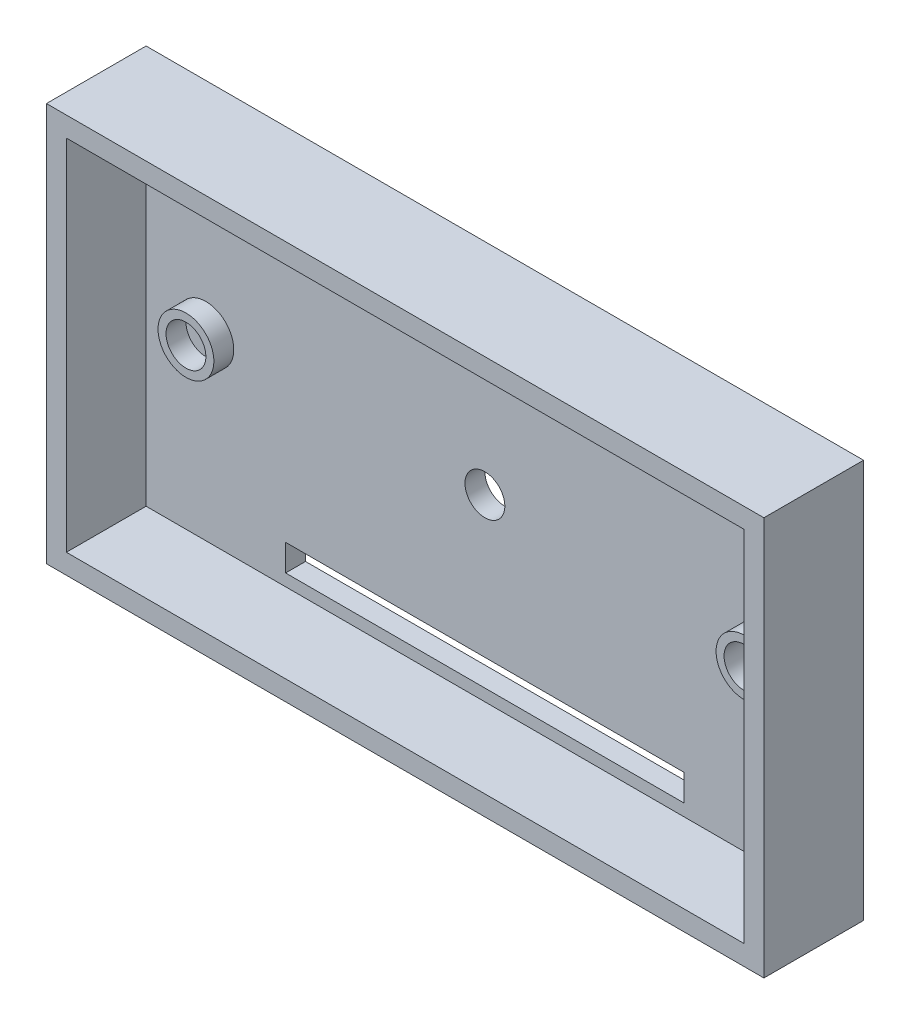
ISO-10303-21;
HEADER;
FILE_DESCRIPTION(('STEP AP214'),'2;1');
FILE_NAME('part.step','',(''),(''),'','','');
FILE_SCHEMA(('AUTOMOTIVE_DESIGN { 1 0 10303 214 1 1 1 1 }'));
ENDSEC;
DATA;
#1=APPLICATION_CONTEXT('core data for automotive mechanical design processes');
#2=APPLICATION_PROTOCOL_DEFINITION('international standard','automotive_design',2000,#1);
#3=PRODUCT_CONTEXT('',#1,'mechanical');
#4=PRODUCT('Part','Part','',(#3));
#5=PRODUCT_RELATED_PRODUCT_CATEGORY('part','',(#4));
#6=PRODUCT_DEFINITION_FORMATION('','',#4);
#7=PRODUCT_DEFINITION_CONTEXT('part definition',#1,'design');
#8=PRODUCT_DEFINITION('design','',#6,#7);
#9=PRODUCT_DEFINITION_SHAPE('','',#8);
#10=(LENGTH_UNIT() NAMED_UNIT(*) SI_UNIT(.MILLI.,.METRE.));
#11=(NAMED_UNIT(*) PLANE_ANGLE_UNIT() SI_UNIT($,.RADIAN.));
#12=(NAMED_UNIT(*) SI_UNIT($,.STERADIAN.) SOLID_ANGLE_UNIT());
#13=UNCERTAINTY_MEASURE_WITH_UNIT(LENGTH_MEASURE(1.E-05),#10,'distance_accuracy_value','');
#14=(GEOMETRIC_REPRESENTATION_CONTEXT(3) GLOBAL_UNCERTAINTY_ASSIGNED_CONTEXT((#13)) GLOBAL_UNIT_ASSIGNED_CONTEXT((#10,
#11,#12)) REPRESENTATION_CONTEXT('',''));
#15=CARTESIAN_POINT('',(0.,0.,0.));
#16=DIRECTION('',(0.,0.,1.));
#17=DIRECTION('',(1.,0.,0.));
#18=AXIS2_PLACEMENT_3D('',#15,#16,#17);
#19=CARTESIAN_POINT('',(57.15,-31.75,3.175));
#20=DIRECTION('',(-1.,0.,0.));
#21=DIRECTION('',(0.,0.,1.));
#22=AXIS2_PLACEMENT_3D('',#19,#20,#21);
#23=PLANE('',#22);
#24=DIRECTION('',(0.,1.,0.));
#25=VECTOR('',#24,1.);
#26=CARTESIAN_POINT('',(57.15,-31.75,0.));
#27=LINE('',#26,#25);
#28=CARTESIAN_POINT('',(57.15,-31.75,0.));
#29=VERTEX_POINT('',#28);
#30=CARTESIAN_POINT('',(57.15,31.75,0.));
#31=VERTEX_POINT('',#30);
#32=EDGE_CURVE('E267',#29,#31,#27,.T.);
#33=ORIENTED_EDGE('',*,*,#32,.T.);
#34=DIRECTION('',(0.,0.,-1.));
#35=VECTOR('',#34,1.);
#36=CARTESIAN_POINT('',(57.15,31.75,3.175));
#37=LINE('',#36,#35);
#38=CARTESIAN_POINT('',(57.15,31.75,15.875));
#39=VERTEX_POINT('',#38);
#40=EDGE_CURVE('E285',#39,#31,#37,.T.);
#41=ORIENTED_EDGE('',*,*,#40,.F.);
#42=DIRECTION('',(0.,1.,0.));
#43=VECTOR('',#42,1.);
#44=CARTESIAN_POINT('',(57.15,-31.75,15.875));
#45=LINE('',#44,#43);
#46=CARTESIAN_POINT('',(57.15,-31.75,15.875));
#47=VERTEX_POINT('',#46);
#48=EDGE_CURVE('E261',#47,#39,#45,.T.);
#49=ORIENTED_EDGE('',*,*,#48,.F.);
#50=DIRECTION('',(0.,0.,-1.));
#51=VECTOR('',#50,1.);
#52=CARTESIAN_POINT('',(57.15,-31.75,3.175));
#53=LINE('',#52,#51);
#54=EDGE_CURVE('E276',#47,#29,#53,.T.);
#55=ORIENTED_EDGE('',*,*,#54,.T.);
#56=EDGE_LOOP('',(#33,#41,#49,#55));
#57=FACE_BOUND('',#56,.T.);
#58=ADVANCED_FACE('F38',(#57),#23,.F.);
#59=CARTESIAN_POINT('',(-57.15,31.75,3.175));
#60=DIRECTION('',(0.,-1.,0.));
#61=DIRECTION('',(0.,0.,-1.));
#62=AXIS2_PLACEMENT_3D('',#59,#60,#61);
#63=PLANE('',#62);
#64=DIRECTION('',(-1.,0.,0.));
#65=VECTOR('',#64,1.);
#66=CARTESIAN_POINT('',(-57.15,31.75,0.));
#67=LINE('',#66,#65);
#68=CARTESIAN_POINT('',(-57.15,31.75,0.));
#69=VERTEX_POINT('',#68);
#70=EDGE_CURVE('E270',#31,#69,#67,.T.);
#71=ORIENTED_EDGE('',*,*,#70,.T.);
#72=DIRECTION('',(0.,0.,-1.));
#73=VECTOR('',#72,1.);
#74=CARTESIAN_POINT('',(-57.15,31.75,3.175));
#75=LINE('',#74,#73);
#76=CARTESIAN_POINT('',(-57.15,31.75,15.875));
#77=VERTEX_POINT('',#76);
#78=EDGE_CURVE('E282',#77,#69,#75,.T.);
#79=ORIENTED_EDGE('',*,*,#78,.F.);
#80=DIRECTION('',(-1.,0.,0.));
#81=VECTOR('',#80,1.);
#82=CARTESIAN_POINT('',(57.15,31.75,15.875));
#83=LINE('',#82,#81);
#84=EDGE_CURVE('E264',#39,#77,#83,.T.);
#85=ORIENTED_EDGE('',*,*,#84,.F.);
#86=ORIENTED_EDGE('',*,*,#40,.T.);
#87=EDGE_LOOP('',(#71,#79,#85,#86));
#88=FACE_BOUND('',#87,.T.);
#89=ADVANCED_FACE('F340',(#88),#63,.F.);
#90=CARTESIAN_POINT('',(-57.15,-31.75,3.175));
#91=DIRECTION('',(1.,0.,0.));
#92=DIRECTION('',(0.,0.,-1.));
#93=AXIS2_PLACEMENT_3D('',#90,#91,#92);
#94=PLANE('',#93);
#95=DIRECTION('',(0.,-1.,0.));
#96=VECTOR('',#95,1.);
#97=CARTESIAN_POINT('',(-57.15,-31.75,0.));
#98=LINE('',#97,#96);
#99=CARTESIAN_POINT('',(-57.15,-31.75,0.));
#100=VERTEX_POINT('',#99);
#101=EDGE_CURVE('E272',#69,#100,#98,.T.);
#102=ORIENTED_EDGE('',*,*,#101,.T.);
#103=DIRECTION('',(0.,0.,-1.));
#104=VECTOR('',#103,1.);
#105=CARTESIAN_POINT('',(-57.15,-31.75,3.175));
#106=LINE('',#105,#104);
#107=CARTESIAN_POINT('',(-57.15,-31.75,15.875));
#108=VERTEX_POINT('',#107);
#109=EDGE_CURVE('E279',#108,#100,#106,.T.);
#110=ORIENTED_EDGE('',*,*,#109,.F.);
#111=DIRECTION('',(0.,-1.,0.));
#112=VECTOR('',#111,1.);
#113=CARTESIAN_POINT('',(-57.15,31.75,15.875));
#114=LINE('',#113,#112);
#115=EDGE_CURVE('E255',#77,#108,#114,.T.);
#116=ORIENTED_EDGE('',*,*,#115,.F.);
#117=ORIENTED_EDGE('',*,*,#78,.T.);
#118=EDGE_LOOP('',(#102,#110,#116,#117));
#119=FACE_BOUND('',#118,.T.);
#120=ADVANCED_FACE('F338',(#119),#94,.F.);
#121=CARTESIAN_POINT('',(-57.15,-31.75,3.175));
#122=DIRECTION('',(0.,1.,0.));
#123=DIRECTION('',(0.,0.,1.));
#124=AXIS2_PLACEMENT_3D('',#121,#122,#123);
#125=PLANE('',#124);
#126=DIRECTION('',(1.,0.,0.));
#127=VECTOR('',#126,1.);
#128=CARTESIAN_POINT('',(-57.15,-31.75,0.));
#129=LINE('',#128,#127);
#130=EDGE_CURVE('E274',#100,#29,#129,.T.);
#131=ORIENTED_EDGE('',*,*,#130,.T.);
#132=ORIENTED_EDGE('',*,*,#54,.F.);
#133=DIRECTION('',(1.,0.,0.));
#134=VECTOR('',#133,1.);
#135=CARTESIAN_POINT('',(-57.15,-31.75,15.875));
#136=LINE('',#135,#134);
#137=EDGE_CURVE('E258',#108,#47,#136,.T.);
#138=ORIENTED_EDGE('',*,*,#137,.F.);
#139=ORIENTED_EDGE('',*,*,#109,.T.);
#140=EDGE_LOOP('',(#131,#132,#138,#139));
#141=FACE_BOUND('',#140,.T.);
#142=ADVANCED_FACE('F320',(#141),#125,.F.);
#143=CARTESIAN_POINT('',(0.,0.,0.));
#144=DIRECTION('',(0.,0.,-1.));
#145=DIRECTION('',(-1.,0.,0.));
#146=AXIS2_PLACEMENT_3D('',#143,#144,#145);
#147=PLANE('',#146);
#148=DIRECTION('',(0.,-1.,0.));
#149=VECTOR('',#148,1.);
#150=CARTESIAN_POINT('',(31.75,-26.67,0.));
#151=LINE('',#150,#149);
#152=CARTESIAN_POINT('',(31.75,-22.436666582,0.));
#153=VERTEX_POINT('',#152);
#154=CARTESIAN_POINT('',(31.75,-26.67,0.));
#155=VERTEX_POINT('',#154);
#156=EDGE_CURVE('E52',#153,#155,#151,.T.);
#157=ORIENTED_EDGE('',*,*,#156,.F.);
#158=DIRECTION('',(1.,0.,0.));
#159=VECTOR('',#158,1.);
#160=CARTESIAN_POINT('',(31.75,-22.436666582,0.));
#161=LINE('',#160,#159);
#162=CARTESIAN_POINT('',(-31.75,-22.436666582,0.));
#163=VERTEX_POINT('',#162);
#164=EDGE_CURVE('E206',#163,#153,#161,.T.);
#165=ORIENTED_EDGE('',*,*,#164,.F.);
#166=DIRECTION('',(0.,1.,0.));
#167=VECTOR('',#166,1.);
#168=CARTESIAN_POINT('',(-31.75,-26.67,0.));
#169=LINE('',#168,#167);
#170=CARTESIAN_POINT('',(-31.75,-26.67,0.));
#171=VERTEX_POINT('',#170);
#172=EDGE_CURVE('E203',#171,#163,#169,.T.);
#173=ORIENTED_EDGE('',*,*,#172,.F.);
#174=DIRECTION('',(-1.,0.,0.));
#175=VECTOR('',#174,1.);
#176=CARTESIAN_POINT('',(31.75,-26.67,0.));
#177=LINE('',#176,#175);
#178=EDGE_CURVE('E200',#155,#171,#177,.T.);
#179=ORIENTED_EDGE('',*,*,#178,.F.);
#180=EDGE_LOOP('',(#157,#165,#173,#179));
#181=FACE_BOUND('',#180,.T.);
#182=DIRECTION('',(0.,-1.,0.));
#183=VECTOR('',#182,1.);
#184=CARTESIAN_POINT('',(31.75,26.67,0.));
#185=LINE('',#184,#183);
#186=CARTESIAN_POINT('',(31.75,26.67,0.));
#187=VERTEX_POINT('',#186);
#188=CARTESIAN_POINT('',(31.75,22.436666582,0.));
#189=VERTEX_POINT('',#188);
#190=EDGE_CURVE('E60',#187,#189,#185,.T.);
#191=ORIENTED_EDGE('',*,*,#190,.F.);
#192=DIRECTION('',(1.,0.,0.));
#193=VECTOR('',#192,1.);
#194=CARTESIAN_POINT('',(31.75,26.67,0.));
#195=LINE('',#194,#193);
#196=CARTESIAN_POINT('',(-31.75,26.67,0.));
#197=VERTEX_POINT('',#196);
#198=EDGE_CURVE('E158',#197,#187,#195,.T.);
#199=ORIENTED_EDGE('',*,*,#198,.F.);
#200=DIRECTION('',(0.,1.,0.));
#201=VECTOR('',#200,1.);
#202=CARTESIAN_POINT('',(-31.75,26.67,0.));
#203=LINE('',#202,#201);
#204=CARTESIAN_POINT('',(-31.75,22.436666582,0.));
#205=VERTEX_POINT('',#204);
#206=EDGE_CURVE('E181',#205,#197,#203,.T.);
#207=ORIENTED_EDGE('',*,*,#206,.F.);
#208=DIRECTION('',(-1.,0.,0.));
#209=VECTOR('',#208,1.);
#210=CARTESIAN_POINT('',(31.75,22.436666582,0.));
#211=LINE('',#210,#209);
#212=EDGE_CURVE('E174',#189,#205,#211,.T.);
#213=ORIENTED_EDGE('',*,*,#212,.F.);
#214=EDGE_LOOP('',(#191,#199,#207,#213));
#215=FACE_BOUND('',#214,.T.);
#216=CARTESIAN_POINT('',(0.,0.,0.));
#217=DIRECTION('',(0.,0.,-1.));
#218=DIRECTION('',(-1.,0.,0.));
#219=AXIS2_PLACEMENT_3D('',#216,#217,#218);
#220=CIRCLE('',#219,3.175);
#221=CARTESIAN_POINT('',(-3.175,0.,0.));
#222=VERTEX_POINT('',#221);
#223=EDGE_CURVE('E166',#222,#222,#220,.T.);
#224=ORIENTED_EDGE('',*,*,#223,.F.);
#225=EDGE_LOOP('',(#224));
#226=FACE_BOUND('',#225,.T.);
#227=ORIENTED_EDGE('',*,*,#32,.F.);
#228=ORIENTED_EDGE('',*,*,#130,.F.);
#229=ORIENTED_EDGE('',*,*,#101,.F.);
#230=ORIENTED_EDGE('',*,*,#70,.F.);
#231=EDGE_LOOP('',(#227,#228,#229,#230));
#232=FACE_BOUND('',#231,.T.);
#233=ADVANCED_FACE('F316',(#181,#215,#226,#232),#147,.T.);
#234=CARTESIAN_POINT('',(0.,0.,15.875));
#235=DIRECTION('',(0.,0.,1.));
#236=DIRECTION('',(1.,0.,0.));
#237=AXIS2_PLACEMENT_3D('',#234,#235,#236);
#238=PLANE('',#237);
#239=ORIENTED_EDGE('',*,*,#115,.T.);
#240=ORIENTED_EDGE('',*,*,#137,.T.);
#241=ORIENTED_EDGE('',*,*,#48,.T.);
#242=ORIENTED_EDGE('',*,*,#84,.T.);
#243=EDGE_LOOP('',(#239,#240,#241,#242));
#244=FACE_BOUND('',#243,.T.);
#245=DIRECTION('',(0.,1.,0.));
#246=VECTOR('',#245,1.);
#247=CARTESIAN_POINT('',(53.975,-28.575,15.875));
#248=LINE('',#247,#246);
#249=CARTESIAN_POINT('',(53.975,-28.575,15.875));
#250=VERTEX_POINT('',#249);
#251=CARTESIAN_POINT('',(53.975,28.575,15.875));
#252=VERTEX_POINT('',#251);
#253=EDGE_CURVE('E228',#250,#252,#248,.T.);
#254=ORIENTED_EDGE('',*,*,#253,.F.);
#255=DIRECTION('',(1.,0.,0.));
#256=VECTOR('',#255,1.);
#257=CARTESIAN_POINT('',(-53.975,-28.575,15.875));
#258=LINE('',#257,#256);
#259=CARTESIAN_POINT('',(-53.975,-28.575,15.875));
#260=VERTEX_POINT('',#259);
#261=EDGE_CURVE('E226',#260,#250,#258,.T.);
#262=ORIENTED_EDGE('',*,*,#261,.F.);
#263=DIRECTION('',(0.,-1.,0.));
#264=VECTOR('',#263,1.);
#265=CARTESIAN_POINT('',(-53.975,28.575,15.875));
#266=LINE('',#265,#264);
#267=CARTESIAN_POINT('',(-53.975,28.575,15.875));
#268=VERTEX_POINT('',#267);
#269=EDGE_CURVE('E234',#268,#260,#266,.T.);
#270=ORIENTED_EDGE('',*,*,#269,.F.);
#271=DIRECTION('',(-1.,0.,0.));
#272=VECTOR('',#271,1.);
#273=CARTESIAN_POINT('',(53.975,28.575,15.875));
#274=LINE('',#273,#272);
#275=EDGE_CURVE('E231',#252,#268,#274,.T.);
#276=ORIENTED_EDGE('',*,*,#275,.F.);
#277=EDGE_LOOP('',(#254,#262,#270,#276));
#278=FACE_BOUND('',#277,.T.);
#279=ADVANCED_FACE('F319',(#244,#278),#238,.T.);
#280=CARTESIAN_POINT('',(-53.975,-28.575,15.875));
#281=DIRECTION('',(0.,1.,0.));
#282=DIRECTION('',(0.,0.,1.));
#283=AXIS2_PLACEMENT_3D('',#280,#281,#282);
#284=PLANE('',#283);
#285=DIRECTION('',(1.,0.,0.));
#286=VECTOR('',#285,1.);
#287=CARTESIAN_POINT('',(-53.975,-28.575,3.175));
#288=LINE('',#287,#286);
#289=CARTESIAN_POINT('',(-53.975,-28.575,3.175));
#290=VERTEX_POINT('',#289);
#291=CARTESIAN_POINT('',(53.975,-28.575,3.175));
#292=VERTEX_POINT('',#291);
#293=EDGE_CURVE('E225',#290,#292,#288,.T.);
#294=ORIENTED_EDGE('',*,*,#293,.F.);
#295=DIRECTION('',(0.,0.,-1.));
#296=VECTOR('',#295,1.);
#297=CARTESIAN_POINT('',(-53.975,-28.575,15.875));
#298=LINE('',#297,#296);
#299=EDGE_CURVE('E236',#260,#290,#298,.T.);
#300=ORIENTED_EDGE('',*,*,#299,.F.);
#301=ORIENTED_EDGE('',*,*,#261,.T.);
#302=DIRECTION('',(0.,0.,-1.));
#303=VECTOR('',#302,1.);
#304=CARTESIAN_POINT('',(53.975,-28.575,15.875));
#305=LINE('',#304,#303);
#306=EDGE_CURVE('E252',#250,#292,#305,.T.);
#307=ORIENTED_EDGE('',*,*,#306,.T.);
#308=EDGE_LOOP('',(#294,#300,#301,#307));
#309=FACE_BOUND('',#308,.T.);
#310=ADVANCED_FACE('F352',(#309),#284,.T.);
#311=CARTESIAN_POINT('',(53.975,-28.575,15.875));
#312=DIRECTION('',(-1.,0.,0.));
#313=DIRECTION('',(0.,0.,1.));
#314=AXIS2_PLACEMENT_3D('',#311,#312,#313);
#315=PLANE('',#314);
#316=DIRECTION('',(0.,1.,0.));
#317=VECTOR('',#316,1.);
#318=CARTESIAN_POINT('',(53.975,-28.575,3.175));
#319=LINE('',#318,#317);
#320=CARTESIAN_POINT('',(53.975,28.575,3.175));
#321=VERTEX_POINT('',#320);
#322=EDGE_CURVE('E239',#292,#321,#319,.T.);
#323=ORIENTED_EDGE('',*,*,#322,.F.);
#324=ORIENTED_EDGE('',*,*,#306,.F.);
#325=ORIENTED_EDGE('',*,*,#253,.T.);
#326=DIRECTION('',(0.,0.,-1.));
#327=VECTOR('',#326,1.);
#328=CARTESIAN_POINT('',(53.975,28.575,15.875));
#329=LINE('',#328,#327);
#330=EDGE_CURVE('E250',#252,#321,#329,.T.);
#331=ORIENTED_EDGE('',*,*,#330,.T.);
#332=EDGE_LOOP('',(#323,#324,#325,#331));
#333=FACE_BOUND('',#332,.T.);
#334=ADVANCED_FACE('F355',(#333),#315,.T.);
#335=CARTESIAN_POINT('',(53.975,28.575,15.875));
#336=DIRECTION('',(0.,-1.,0.));
#337=DIRECTION('',(0.,0.,-1.));
#338=AXIS2_PLACEMENT_3D('',#335,#336,#337);
#339=PLANE('',#338);
#340=DIRECTION('',(-1.,0.,0.));
#341=VECTOR('',#340,1.);
#342=CARTESIAN_POINT('',(53.975,28.575,3.175));
#343=LINE('',#342,#341);
#344=CARTESIAN_POINT('',(-53.975,28.575,3.175));
#345=VERTEX_POINT('',#344);
#346=EDGE_CURVE('E242',#321,#345,#343,.T.);
#347=ORIENTED_EDGE('',*,*,#346,.F.);
#348=ORIENTED_EDGE('',*,*,#330,.F.);
#349=ORIENTED_EDGE('',*,*,#275,.T.);
#350=DIRECTION('',(0.,0.,-1.));
#351=VECTOR('',#350,1.);
#352=CARTESIAN_POINT('',(-53.975,28.575,15.875));
#353=LINE('',#352,#351);
#354=EDGE_CURVE('E248',#268,#345,#353,.T.);
#355=ORIENTED_EDGE('',*,*,#354,.T.);
#356=EDGE_LOOP('',(#347,#348,#349,#355));
#357=FACE_BOUND('',#356,.T.);
#358=ADVANCED_FACE('F359',(#357),#339,.T.);
#359=CARTESIAN_POINT('',(-53.975,28.575,15.875));
#360=DIRECTION('',(1.,0.,0.));
#361=DIRECTION('',(0.,0.,-1.));
#362=AXIS2_PLACEMENT_3D('',#359,#360,#361);
#363=PLANE('',#362);
#364=DIRECTION('',(0.,-1.,0.));
#365=VECTOR('',#364,1.);
#366=CARTESIAN_POINT('',(-53.975,28.575,3.175));
#367=LINE('',#366,#365);
#368=EDGE_CURVE('E229',#345,#290,#367,.T.);
#369=ORIENTED_EDGE('',*,*,#368,.F.);
#370=ORIENTED_EDGE('',*,*,#354,.F.);
#371=ORIENTED_EDGE('',*,*,#269,.T.);
#372=ORIENTED_EDGE('',*,*,#299,.T.);
#373=EDGE_LOOP('',(#369,#370,#371,#372));
#374=FACE_BOUND('',#373,.T.);
#375=ADVANCED_FACE('F295',(#374),#363,.T.);
#376=CARTESIAN_POINT('',(0.,0.,3.175));
#377=DIRECTION('',(0.,0.,-1.));
#378=DIRECTION('',(-1.,0.,0.));
#379=AXIS2_PLACEMENT_3D('',#376,#377,#378);
#380=PLANE('',#379);
#381=CARTESIAN_POINT('',(-44.45,0.,3.175));
#382=DIRECTION('',(0.,0.,-1.));
#383=DIRECTION('',(-1.,0.,0.));
#384=AXIS2_PLACEMENT_3D('',#381,#382,#383);
#385=CIRCLE('',#384,4.445);
#386=CARTESIAN_POINT('',(-48.895,0.,3.175));
#387=VERTEX_POINT('',#386);
#388=EDGE_CURVE('E11',#387,#387,#385,.F.);
#389=ORIENTED_EDGE('',*,*,#388,.F.);
#390=EDGE_LOOP('',(#389));
#391=FACE_BOUND('',#390,.T.);
#392=CARTESIAN_POINT('',(44.45,0.,3.175));
#393=DIRECTION('',(0.,0.,-1.));
#394=DIRECTION('',(-1.,0.,0.));
#395=AXIS2_PLACEMENT_3D('',#392,#393,#394);
#396=CIRCLE('',#395,4.445);
#397=CARTESIAN_POINT('',(40.005,0.,3.175));
#398=VERTEX_POINT('',#397);
#399=EDGE_CURVE('E45',#398,#398,#396,.F.);
#400=ORIENTED_EDGE('',*,*,#399,.F.);
#401=EDGE_LOOP('',(#400));
#402=FACE_BOUND('',#401,.T.);
#403=DIRECTION('',(-1.,0.,0.));
#404=VECTOR('',#403,1.);
#405=CARTESIAN_POINT('',(31.75,-22.436666582,3.175));
#406=LINE('',#405,#404);
#407=CARTESIAN_POINT('',(31.75,-22.436666582,3.175));
#408=VERTEX_POINT('',#407);
#409=CARTESIAN_POINT('',(-31.75,-22.436666582,3.175));
#410=VERTEX_POINT('',#409);
#411=EDGE_CURVE('E192',#408,#410,#406,.T.);
#412=ORIENTED_EDGE('',*,*,#411,.F.);
#413=DIRECTION('',(0.,1.,0.));
#414=VECTOR('',#413,1.);
#415=CARTESIAN_POINT('',(31.75,-26.67,3.175));
#416=LINE('',#415,#414);
#417=CARTESIAN_POINT('',(31.75,-26.67,3.175));
#418=VERTEX_POINT('',#417);
#419=EDGE_CURVE('E196',#418,#408,#416,.T.);
#420=ORIENTED_EDGE('',*,*,#419,.F.);
#421=DIRECTION('',(1.,0.,0.));
#422=VECTOR('',#421,1.);
#423=CARTESIAN_POINT('',(31.75,-26.67,3.175));
#424=LINE('',#423,#422);
#425=CARTESIAN_POINT('',(-31.75,-26.67,3.175));
#426=VERTEX_POINT('',#425);
#427=EDGE_CURVE('E212',#426,#418,#424,.T.);
#428=ORIENTED_EDGE('',*,*,#427,.F.);
#429=DIRECTION('',(0.,-1.,0.));
#430=VECTOR('',#429,1.);
#431=CARTESIAN_POINT('',(-31.75,-26.67,3.175));
#432=LINE('',#431,#430);
#433=EDGE_CURVE('E190',#410,#426,#432,.T.);
#434=ORIENTED_EDGE('',*,*,#433,.F.);
#435=EDGE_LOOP('',(#412,#420,#428,#434));
#436=FACE_BOUND('',#435,.T.);
#437=DIRECTION('',(-1.,0.,0.));
#438=VECTOR('',#437,1.);
#439=CARTESIAN_POINT('',(31.75,26.67,3.175));
#440=LINE('',#439,#438);
#441=CARTESIAN_POINT('',(31.75,26.67,3.175));
#442=VERTEX_POINT('',#441);
#443=CARTESIAN_POINT('',(-31.75,26.67,3.175));
#444=VERTEX_POINT('',#443);
#445=EDGE_CURVE('E172',#442,#444,#440,.T.);
#446=ORIENTED_EDGE('',*,*,#445,.F.);
#447=DIRECTION('',(0.,1.,0.));
#448=VECTOR('',#447,1.);
#449=CARTESIAN_POINT('',(31.75,26.67,3.175));
#450=LINE('',#449,#448);
#451=CARTESIAN_POINT('',(31.75,22.436666582,3.175));
#452=VERTEX_POINT('',#451);
#453=EDGE_CURVE('E152',#452,#442,#450,.T.);
#454=ORIENTED_EDGE('',*,*,#453,.F.);
#455=DIRECTION('',(1.,0.,0.));
#456=VECTOR('',#455,1.);
#457=CARTESIAN_POINT('',(31.75,22.436666582,3.175));
#458=LINE('',#457,#456);
#459=CARTESIAN_POINT('',(-31.75,22.436666582,3.175));
#460=VERTEX_POINT('',#459);
#461=EDGE_CURVE('E162',#460,#452,#458,.T.);
#462=ORIENTED_EDGE('',*,*,#461,.F.);
#463=DIRECTION('',(0.,-1.,0.));
#464=VECTOR('',#463,1.);
#465=CARTESIAN_POINT('',(-31.75,26.67,3.175));
#466=LINE('',#465,#464);
#467=EDGE_CURVE('E176',#444,#460,#466,.T.);
#468=ORIENTED_EDGE('',*,*,#467,.F.);
#469=EDGE_LOOP('',(#446,#454,#462,#468));
#470=FACE_BOUND('',#469,.T.);
#471=CARTESIAN_POINT('',(0.,0.,3.175));
#472=DIRECTION('',(0.,0.,-1.));
#473=DIRECTION('',(-1.,0.,0.));
#474=AXIS2_PLACEMENT_3D('',#471,#472,#473);
#475=CIRCLE('',#474,3.175);
#476=CARTESIAN_POINT('',(-3.175,0.,3.175));
#477=VERTEX_POINT('',#476);
#478=EDGE_CURVE('E222',#477,#477,#475,.F.);
#479=ORIENTED_EDGE('',*,*,#478,.F.);
#480=EDGE_LOOP('',(#479));
#481=FACE_BOUND('',#480,.T.);
#482=ORIENTED_EDGE('',*,*,#368,.T.);
#483=ORIENTED_EDGE('',*,*,#293,.T.);
#484=ORIENTED_EDGE('',*,*,#322,.T.);
#485=ORIENTED_EDGE('',*,*,#346,.T.);
#486=EDGE_LOOP('',(#482,#483,#484,#485));
#487=FACE_BOUND('',#486,.T.);
#488=ADVANCED_FACE('F169',(#391,#402,#436,#470,#481,#487),#380,.F.);
#489=CARTESIAN_POINT('',(0.,0.,15.876));
#490=DIRECTION('',(0.,0.,-1.));
#491=DIRECTION('',(-1.,0.,0.));
#492=AXIS2_PLACEMENT_3D('',#489,#490,#491);
#493=CYLINDRICAL_SURFACE('',#492,3.175);
#494=ORIENTED_EDGE('',*,*,#223,.T.);
#495=EDGE_LOOP('',(#494));
#496=FACE_BOUND('',#495,.T.);
#497=ORIENTED_EDGE('',*,*,#478,.T.);
#498=EDGE_LOOP('',(#497));
#499=FACE_BOUND('',#498,.T.);
#500=ADVANCED_FACE('F294',(#496,#499),#493,.F.);
#501=CARTESIAN_POINT('',(31.75,26.67,15.876));
#502=DIRECTION('',(1.,0.,0.));
#503=DIRECTION('',(0.,0.,-1.));
#504=AXIS2_PLACEMENT_3D('',#501,#502,#503);
#505=PLANE('',#504);
#506=ORIENTED_EDGE('',*,*,#453,.T.);
#507=DIRECTION('',(0.,0.,-1.));
#508=VECTOR('',#507,1.);
#509=CARTESIAN_POINT('',(31.75,26.67,15.876));
#510=LINE('',#509,#508);
#511=EDGE_CURVE('E167',#442,#187,#510,.T.);
#512=ORIENTED_EDGE('',*,*,#511,.T.);
#513=ORIENTED_EDGE('',*,*,#190,.T.);
#514=DIRECTION('',(0.,0.,-1.));
#515=VECTOR('',#514,1.);
#516=CARTESIAN_POINT('',(31.75,22.436666582,15.876));
#517=LINE('',#516,#515);
#518=EDGE_CURVE('E148',#452,#189,#517,.T.);
#519=ORIENTED_EDGE('',*,*,#518,.F.);
#520=EDGE_LOOP('',(#506,#512,#513,#519));
#521=FACE_BOUND('',#520,.T.);
#522=ADVANCED_FACE('F150',(#521),#505,.F.);
#523=CARTESIAN_POINT('',(31.75,26.67,15.876));
#524=DIRECTION('',(0.,1.,0.));
#525=DIRECTION('',(0.,0.,1.));
#526=AXIS2_PLACEMENT_3D('',#523,#524,#525);
#527=PLANE('',#526);
#528=ORIENTED_EDGE('',*,*,#445,.T.);
#529=DIRECTION('',(0.,0.,-1.));
#530=VECTOR('',#529,1.);
#531=CARTESIAN_POINT('',(-31.75,26.67,15.876));
#532=LINE('',#531,#530);
#533=EDGE_CURVE('E187',#444,#197,#532,.T.);
#534=ORIENTED_EDGE('',*,*,#533,.T.);
#535=ORIENTED_EDGE('',*,*,#198,.T.);
#536=ORIENTED_EDGE('',*,*,#511,.F.);
#537=EDGE_LOOP('',(#528,#534,#535,#536));
#538=FACE_BOUND('',#537,.T.);
#539=ADVANCED_FACE('F381',(#538),#527,.F.);
#540=CARTESIAN_POINT('',(-31.75,26.67,15.876));
#541=DIRECTION('',(-1.,0.,0.));
#542=DIRECTION('',(0.,0.,1.));
#543=AXIS2_PLACEMENT_3D('',#540,#541,#542);
#544=PLANE('',#543);
#545=ORIENTED_EDGE('',*,*,#467,.T.);
#546=DIRECTION('',(0.,0.,-1.));
#547=VECTOR('',#546,1.);
#548=CARTESIAN_POINT('',(-31.75,22.436666582,15.876));
#549=LINE('',#548,#547);
#550=EDGE_CURVE('E157',#460,#205,#549,.T.);
#551=ORIENTED_EDGE('',*,*,#550,.T.);
#552=ORIENTED_EDGE('',*,*,#206,.T.);
#553=ORIENTED_EDGE('',*,*,#533,.F.);
#554=EDGE_LOOP('',(#545,#551,#552,#553));
#555=FACE_BOUND('',#554,.T.);
#556=ADVANCED_FACE('F384',(#555),#544,.F.);
#557=CARTESIAN_POINT('',(31.75,22.436666582,15.876));
#558=DIRECTION('',(0.,-1.,0.));
#559=DIRECTION('',(1.,0.,0.));
#560=AXIS2_PLACEMENT_3D('',#557,#558,#559);
#561=PLANE('',#560);
#562=ORIENTED_EDGE('',*,*,#461,.T.);
#563=ORIENTED_EDGE('',*,*,#518,.T.);
#564=ORIENTED_EDGE('',*,*,#212,.T.);
#565=ORIENTED_EDGE('',*,*,#550,.F.);
#566=EDGE_LOOP('',(#562,#563,#564,#565));
#567=FACE_BOUND('',#566,.T.);
#568=ADVANCED_FACE('F163',(#567),#561,.F.);
#569=CARTESIAN_POINT('',(31.75,-26.67,15.876));
#570=DIRECTION('',(1.,0.,0.));
#571=DIRECTION('',(0.,0.,-1.));
#572=AXIS2_PLACEMENT_3D('',#569,#570,#571);
#573=PLANE('',#572);
#574=ORIENTED_EDGE('',*,*,#419,.T.);
#575=DIRECTION('',(0.,0.,-1.));
#576=VECTOR('',#575,1.);
#577=CARTESIAN_POINT('',(31.75,-22.436666582,15.876));
#578=LINE('',#577,#576);
#579=EDGE_CURVE('E210',#408,#153,#578,.T.);
#580=ORIENTED_EDGE('',*,*,#579,.T.);
#581=ORIENTED_EDGE('',*,*,#156,.T.);
#582=DIRECTION('',(0.,0.,-1.));
#583=VECTOR('',#582,1.);
#584=CARTESIAN_POINT('',(31.75,-26.67,15.876));
#585=LINE('',#584,#583);
#586=EDGE_CURVE('E209',#418,#155,#585,.T.);
#587=ORIENTED_EDGE('',*,*,#586,.F.);
#588=EDGE_LOOP('',(#574,#580,#581,#587));
#589=FACE_BOUND('',#588,.T.);
#590=ADVANCED_FACE('F307',(#589),#573,.F.);
#591=CARTESIAN_POINT('',(31.75,-22.436666582,15.876));
#592=DIRECTION('',(0.,1.,0.));
#593=DIRECTION('',(-1.,0.,0.));
#594=AXIS2_PLACEMENT_3D('',#591,#592,#593);
#595=PLANE('',#594);
#596=ORIENTED_EDGE('',*,*,#411,.T.);
#597=DIRECTION('',(0.,0.,-1.));
#598=VECTOR('',#597,1.);
#599=CARTESIAN_POINT('',(-31.75,-22.436666582,15.876));
#600=LINE('',#599,#598);
#601=EDGE_CURVE('E213',#410,#163,#600,.T.);
#602=ORIENTED_EDGE('',*,*,#601,.T.);
#603=ORIENTED_EDGE('',*,*,#164,.T.);
#604=ORIENTED_EDGE('',*,*,#579,.F.);
#605=EDGE_LOOP('',(#596,#602,#603,#604));
#606=FACE_BOUND('',#605,.T.);
#607=ADVANCED_FACE('F305',(#606),#595,.F.);
#608=CARTESIAN_POINT('',(-31.75,-26.67,15.876));
#609=DIRECTION('',(-1.,0.,0.));
#610=DIRECTION('',(0.,0.,1.));
#611=AXIS2_PLACEMENT_3D('',#608,#609,#610);
#612=PLANE('',#611);
#613=ORIENTED_EDGE('',*,*,#433,.T.);
#614=DIRECTION('',(0.,0.,-1.));
#615=VECTOR('',#614,1.);
#616=CARTESIAN_POINT('',(-31.75,-26.67,15.876));
#617=LINE('',#616,#615);
#618=EDGE_CURVE('E215',#426,#171,#617,.T.);
#619=ORIENTED_EDGE('',*,*,#618,.T.);
#620=ORIENTED_EDGE('',*,*,#172,.T.);
#621=ORIENTED_EDGE('',*,*,#601,.F.);
#622=EDGE_LOOP('',(#613,#619,#620,#621));
#623=FACE_BOUND('',#622,.T.);
#624=ADVANCED_FACE('F314',(#623),#612,.F.);
#625=CARTESIAN_POINT('',(31.75,-26.67,15.876));
#626=DIRECTION('',(0.,-1.,0.));
#627=DIRECTION('',(0.,0.,-1.));
#628=AXIS2_PLACEMENT_3D('',#625,#626,#627);
#629=PLANE('',#628);
#630=ORIENTED_EDGE('',*,*,#427,.T.);
#631=ORIENTED_EDGE('',*,*,#586,.T.);
#632=ORIENTED_EDGE('',*,*,#178,.T.);
#633=ORIENTED_EDGE('',*,*,#618,.F.);
#634=EDGE_LOOP('',(#630,#631,#632,#633));
#635=FACE_BOUND('',#634,.T.);
#636=ADVANCED_FACE('F311',(#635),#629,.F.);
#637=CARTESIAN_POINT('',(44.45,0.,6.35));
#638=DIRECTION('',(0.,0.,1.));
#639=DIRECTION('',(1.,0.,0.));
#640=AXIS2_PLACEMENT_3D('',#637,#638,#639);
#641=PLANE('',#640);
#642=CARTESIAN_POINT('',(44.45,0.,6.35));
#643=DIRECTION('',(0.,0.,1.));
#644=DIRECTION('',(1.,0.,0.));
#645=AXIS2_PLACEMENT_3D('',#642,#643,#644);
#646=CIRCLE('',#645,4.445);
#647=CARTESIAN_POINT('',(48.895,0.,6.35));
#648=VERTEX_POINT('',#647);
#649=EDGE_CURVE('E193',#648,#648,#646,.T.);
#650=ORIENTED_EDGE('',*,*,#649,.T.);
#651=EDGE_LOOP('',(#650));
#652=FACE_BOUND('',#651,.T.);
#653=CARTESIAN_POINT('',(44.45,0.,6.35));
#654=DIRECTION('',(0.,0.,1.));
#655=DIRECTION('',(1.,0.,0.));
#656=AXIS2_PLACEMENT_3D('',#653,#654,#655);
#657=CIRCLE('',#656,3.175);
#658=CARTESIAN_POINT('',(47.625,0.,6.35));
#659=VERTEX_POINT('',#658);
#660=EDGE_CURVE('E430',#659,#659,#657,.T.);
#661=ORIENTED_EDGE('',*,*,#660,.F.);
#662=EDGE_LOOP('',(#661));
#663=FACE_BOUND('',#662,.T.);
#664=ADVANCED_FACE('F374',(#652,#663),#641,.T.);
#665=CARTESIAN_POINT('',(44.45,0.,6.35));
#666=DIRECTION('',(0.,0.,-1.));
#667=DIRECTION('',(-1.,0.,0.));
#668=AXIS2_PLACEMENT_3D('',#665,#666,#667);
#669=CYLINDRICAL_SURFACE('',#668,4.445);
#670=ORIENTED_EDGE('',*,*,#649,.F.);
#671=EDGE_LOOP('',(#670));
#672=FACE_BOUND('',#671,.T.);
#673=ORIENTED_EDGE('',*,*,#399,.T.);
#674=EDGE_LOOP('',(#673));
#675=FACE_BOUND('',#674,.T.);
#676=ADVANCED_FACE('F290',(#672,#675),#669,.T.);
#677=CARTESIAN_POINT('',(44.45,0.,6.35));
#678=DIRECTION('',(0.,0.,-1.));
#679=DIRECTION('',(-1.,0.,0.));
#680=AXIS2_PLACEMENT_3D('',#677,#678,#679);
#681=CYLINDRICAL_SURFACE('',#680,3.175);
#682=ORIENTED_EDGE('',*,*,#660,.T.);
#683=EDGE_LOOP('',(#682));
#684=FACE_BOUND('',#683,.T.);
#685=CARTESIAN_POINT('',(44.45,0.,3.175));
#686=DIRECTION('',(0.,0.,1.));
#687=DIRECTION('',(1.,0.,0.));
#688=AXIS2_PLACEMENT_3D('',#685,#686,#687);
#689=CIRCLE('',#688,3.175);
#690=CARTESIAN_POINT('',(47.625,0.,3.175));
#691=VERTEX_POINT('',#690);
#692=EDGE_CURVE('E429',#691,#691,#689,.T.);
#693=ORIENTED_EDGE('',*,*,#692,.F.);
#694=EDGE_LOOP('',(#693));
#695=FACE_BOUND('',#694,.T.);
#696=ADVANCED_FACE('F393',(#684,#695),#681,.F.);
#697=ORIENTED_EDGE('',*,*,#692,.T.);
#698=EDGE_LOOP('',(#697));
#699=FACE_BOUND('',#698,.T.);
#700=ADVANCED_FACE('F299',(#699),#380,.F.);
#701=CARTESIAN_POINT('',(-44.45,0.,6.35));
#702=DIRECTION('',(0.,0.,-1.));
#703=DIRECTION('',(-1.,0.,0.));
#704=AXIS2_PLACEMENT_3D('',#701,#702,#703);
#705=PLANE('',#704);
#706=CARTESIAN_POINT('',(-44.45,0.,6.35));
#707=DIRECTION('',(0.,0.,1.));
#708=DIRECTION('',(-1.,0.,0.));
#709=AXIS2_PLACEMENT_3D('',#706,#707,#708);
#710=CIRCLE('',#709,4.445);
#711=CARTESIAN_POINT('',(-48.895,0.,6.35));
#712=VERTEX_POINT('',#711);
#713=EDGE_CURVE('E424',#712,#712,#710,.T.);
#714=ORIENTED_EDGE('',*,*,#713,.T.);
#715=EDGE_LOOP('',(#714));
#716=FACE_BOUND('',#715,.T.);
#717=CARTESIAN_POINT('',(-44.45,0.,6.35));
#718=DIRECTION('',(0.,0.,1.));
#719=DIRECTION('',(-1.,0.,0.));
#720=AXIS2_PLACEMENT_3D('',#717,#718,#719);
#721=CIRCLE('',#720,3.175);
#722=CARTESIAN_POINT('',(-47.625,0.,6.35));
#723=VERTEX_POINT('',#722);
#724=EDGE_CURVE('E419',#723,#723,#721,.T.);
#725=ORIENTED_EDGE('',*,*,#724,.F.);
#726=EDGE_LOOP('',(#725));
#727=FACE_BOUND('',#726,.T.);
#728=ADVANCED_FACE('F405',(#716,#727),#705,.F.);
#729=CARTESIAN_POINT('',(-44.45,0.,6.35));
#730=DIRECTION('',(0.,0.,-1.));
#731=DIRECTION('',(-1.,0.,0.));
#732=AXIS2_PLACEMENT_3D('',#729,#730,#731);
#733=CYLINDRICAL_SURFACE('',#732,4.445);
#734=ORIENTED_EDGE('',*,*,#713,.F.);
#735=EDGE_LOOP('',(#734));
#736=FACE_BOUND('',#735,.T.);
#737=ORIENTED_EDGE('',*,*,#388,.T.);
#738=EDGE_LOOP('',(#737));
#739=FACE_BOUND('',#738,.T.);
#740=ADVANCED_FACE('F401',(#736,#739),#733,.T.);
#741=CARTESIAN_POINT('',(-44.45,0.,6.35));
#742=DIRECTION('',(0.,0.,-1.));
#743=DIRECTION('',(-1.,0.,0.));
#744=AXIS2_PLACEMENT_3D('',#741,#742,#743);
#745=CYLINDRICAL_SURFACE('',#744,3.175);
#746=ORIENTED_EDGE('',*,*,#724,.T.);
#747=EDGE_LOOP('',(#746));
#748=FACE_BOUND('',#747,.T.);
#749=CARTESIAN_POINT('',(-44.45,0.,3.175));
#750=DIRECTION('',(0.,0.,1.));
#751=DIRECTION('',(-1.,0.,0.));
#752=AXIS2_PLACEMENT_3D('',#749,#750,#751);
#753=CIRCLE('',#752,3.175);
#754=CARTESIAN_POINT('',(-47.625,0.,3.175));
#755=VERTEX_POINT('',#754);
#756=EDGE_CURVE('E422',#755,#755,#753,.T.);
#757=ORIENTED_EDGE('',*,*,#756,.F.);
#758=EDGE_LOOP('',(#757));
#759=FACE_BOUND('',#758,.T.);
#760=ADVANCED_FACE('F404',(#748,#759),#745,.F.);
#761=ORIENTED_EDGE('',*,*,#756,.T.);
#762=EDGE_LOOP('',(#761));
#763=FACE_BOUND('',#762,.T.);
#764=ADVANCED_FACE('F298',(#763),#380,.F.);
#765=CLOSED_SHELL('',(#58,#89,#120,#142,#233,#279,#310,#334,#358,#375,#488,#500,#522,#539,#556,
#568,#590,#607,#624,#636,#664,#676,#696,#700,#728,#740,#760,#764));
#766=MANIFOLD_SOLID_BREP('B2',#765);
#767=ADVANCED_BREP_SHAPE_REPRESENTATION('',(#18,#766),#14);
#768=SHAPE_DEFINITION_REPRESENTATION(#9,#767);
ENDSEC;
END-ISO-10303-21;
